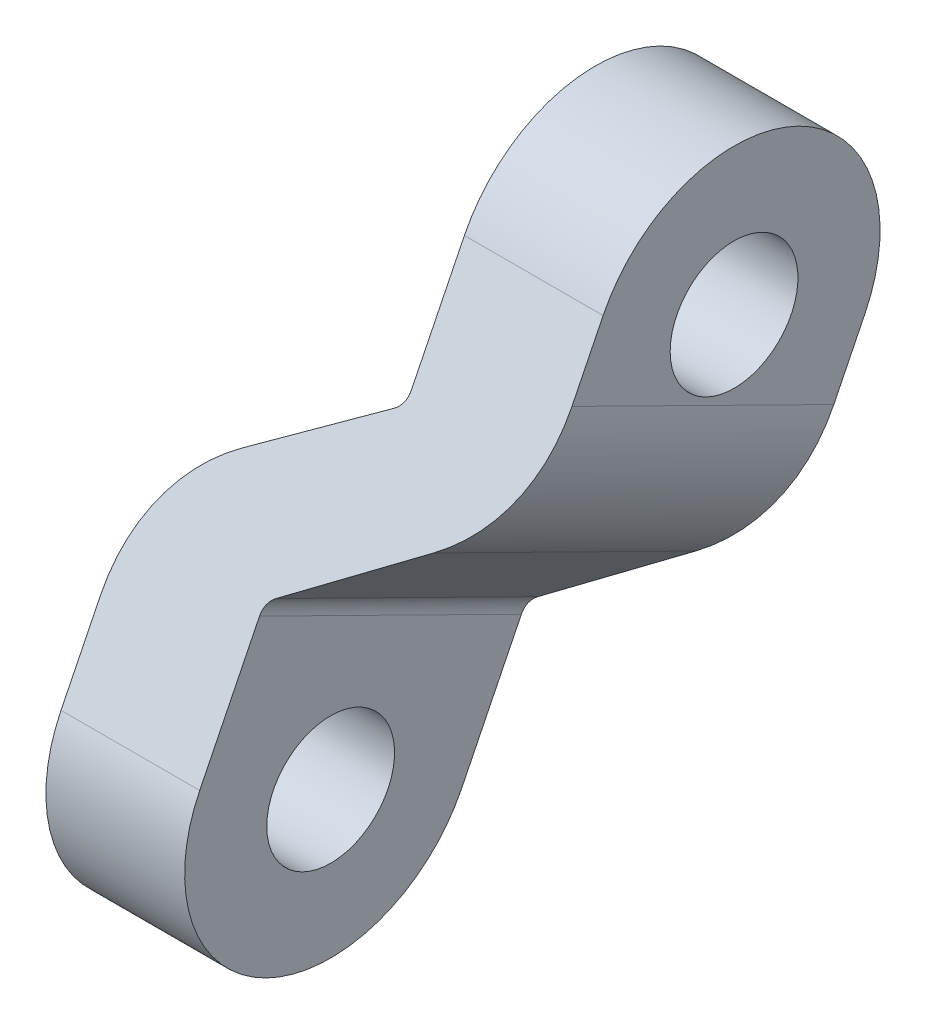
ISO-10303-21;
HEADER;
FILE_DESCRIPTION(('STEP AP214'),'2;1');
FILE_NAME('part.step','',(''),(''),'','','');
FILE_SCHEMA(('AUTOMOTIVE_DESIGN { 1 0 10303 214 1 1 1 1 }'));
ENDSEC;
DATA;
#1=APPLICATION_CONTEXT('core data for automotive mechanical design processes');
#2=APPLICATION_PROTOCOL_DEFINITION('international standard','automotive_design',2000,#1);
#3=PRODUCT_CONTEXT('',#1,'mechanical');
#4=PRODUCT('Part','Part','',(#3));
#5=PRODUCT_RELATED_PRODUCT_CATEGORY('part','',(#4));
#6=PRODUCT_DEFINITION_FORMATION('','',#4);
#7=PRODUCT_DEFINITION_CONTEXT('part definition',#1,'design');
#8=PRODUCT_DEFINITION('design','',#6,#7);
#9=PRODUCT_DEFINITION_SHAPE('','',#8);
#10=(LENGTH_UNIT() NAMED_UNIT(*) SI_UNIT(.MILLI.,.METRE.));
#11=(NAMED_UNIT(*) PLANE_ANGLE_UNIT() SI_UNIT($,.RADIAN.));
#12=(NAMED_UNIT(*) SI_UNIT($,.STERADIAN.) SOLID_ANGLE_UNIT());
#13=UNCERTAINTY_MEASURE_WITH_UNIT(LENGTH_MEASURE(1.E-05),#10,'distance_accuracy_value','');
#14=(GEOMETRIC_REPRESENTATION_CONTEXT(3) GLOBAL_UNCERTAINTY_ASSIGNED_CONTEXT((#13)) GLOBAL_UNIT_ASSIGNED_CONTEXT((#10,
#11,#12)) REPRESENTATION_CONTEXT('',''));
#15=CARTESIAN_POINT('',(0.,0.,0.));
#16=DIRECTION('',(0.,0.,1.));
#17=DIRECTION('',(1.,0.,0.));
#18=AXIS2_PLACEMENT_3D('',#15,#16,#17);
#19=CARTESIAN_POINT('',(-31.2808383876836,-34.2216398458266,-78.2312229652691));
#20=DIRECTION('',(1.,0.,0.));
#21=DIRECTION('',(0.,0.,-1.));
#22=AXIS2_PLACEMENT_3D('',#19,#20,#21);
#23=PLANE('',#22);
#24=DIRECTION('',(0.,-0.89666578156707,0.44270811621961));
#25=VECTOR('',#24,1.);
#26=CARTESIAN_POINT('',(-31.2808383876836,-40.567413857167,-91.0840219202898));
#27=LINE('',#26,#25);
#28=CARTESIAN_POINT('',(-31.2808383876836,-44.5116153096804,-89.1366631262682));
#29=VERTEX_POINT('',#28);
#30=CARTESIAN_POINT('',(-31.2808383876836,-47.4618516108228,-87.680051775494));
#31=VERTEX_POINT('',#30);
#32=EDGE_CURVE('E145',#29,#31,#27,.T.);
#33=ORIENTED_EDGE('',*,*,#32,.T.);
#34=DIRECTION('',(0.,-0.442708116219611,-0.89666578156707));
#35=VECTOR('',#34,1.);
#36=CARTESIAN_POINT('',(-31.2808383876836,-43.9201866810659,-80.5067255229574));
#37=LINE('',#36,#35);
#38=CARTESIAN_POINT('',(-31.2808383876836,-43.9201866810659,-80.5067255229574));
#39=VERTEX_POINT('',#38);
#40=EDGE_CURVE('E193',#31,#39,#37,.F.);
#41=ORIENTED_EDGE('',*,*,#40,.T.);
#42=DIRECTION('',(0.,0.896665781567074,-0.442708116219602));
#43=VECTOR('',#42,1.);
#44=CARTESIAN_POINT('',(-31.2808383876836,-40.9699503799235,-81.9633368737316));
#45=LINE('',#44,#43);
#46=CARTESIAN_POINT('',(-31.2808383876836,-40.9699503799235,-81.9633368737316));
#47=VERTEX_POINT('',#46);
#48=EDGE_CURVE('E169',#39,#47,#45,.T.);
#49=ORIENTED_EDGE('',*,*,#48,.T.);
#50=CARTESIAN_POINT('',(-31.2808383876836,-42.7407828448019,-85.55));
#51=DIRECTION('',(1.,0.,0.));
#52=DIRECTION('',(0.,0.,-1.));
#53=AXIS2_PLACEMENT_3D('',#50,#51,#52);
#54=CIRCLE('',#53,4.00000000000002);
#55=EDGE_CURVE('E244',#47,#29,#54,.F.);
#56=ORIENTED_EDGE('',*,*,#55,.T.);
#57=EDGE_LOOP('',(#33,#41,#49,#56));
#58=FACE_BOUND('',#57,.T.);
#59=CARTESIAN_POINT('',(-31.2808383876836,-42.7407828448019,-85.55));
#60=DIRECTION('',(-1.,0.,0.));
#61=DIRECTION('',(0.,0.,1.));
#62=AXIS2_PLACEMENT_3D('',#59,#60,#61);
#63=CIRCLE('',#62,1.75000000000002);
#64=CARTESIAN_POINT('',(-31.2808383876836,-42.7407828448019,-83.8));
#65=VERTEX_POINT('',#64);
#66=EDGE_CURVE('E280',#65,#65,#63,.T.);
#67=ORIENTED_EDGE('',*,*,#66,.F.);
#68=EDGE_LOOP('',(#67));
#69=FACE_BOUND('',#68,.T.);
#70=ADVANCED_FACE('F43',(#58,#69),#23,.F.);
#71=CARTESIAN_POINT('',(-36.7808383876836,-42.7407828448019,-85.55));
#72=DIRECTION('',(1.,0.,0.));
#73=DIRECTION('',(0.,0.,-1.));
#74=AXIS2_PLACEMENT_3D('',#71,#72,#73);
#75=PLANE('',#74);
#76=DIRECTION('',(0.,-0.896665781567074,0.442708116219602));
#77=VECTOR('',#76,1.);
#78=CARTESIAN_POINT('',(-36.7808383876836,-40.9699503799235,-81.9633368737316));
#79=LINE('',#78,#77);
#80=CARTESIAN_POINT('',(-36.7808383876836,-50.0248169702635,-77.4927046568721));
#81=VERTEX_POINT('',#80);
#82=CARTESIAN_POINT('',(-36.7808383876836,-52.2109800908596,-76.4133368737318));
#83=VERTEX_POINT('',#82);
#84=EDGE_CURVE('E231',#81,#83,#79,.T.);
#85=ORIENTED_EDGE('',*,*,#84,.F.);
#86=DIRECTION('',(0.,-0.442708116219611,-0.89666578156707));
#87=VECTOR('',#86,1.);
#88=CARTESIAN_POINT('',(-36.7808383876836,-51.7956494351419,-81.0793677831404));
#89=LINE('',#88,#87);
#90=CARTESIAN_POINT('',(-36.7808383876836,-53.5664819000203,-84.6660309094086));
#91=VERTEX_POINT('',#90);
#92=EDGE_CURVE('E52',#81,#91,#89,.T.);
#93=ORIENTED_EDGE('',*,*,#92,.T.);
#94=DIRECTION('',(0.,0.89666578156707,-0.442708116219611));
#95=VECTOR('',#94,1.);
#96=CARTESIAN_POINT('',(-36.7808383876836,-55.7526450206165,-83.5866631262682));
#97=LINE('',#96,#95);
#98=CARTESIAN_POINT('',(-36.7808383876836,-55.7526450206165,-83.5866631262682));
#99=VERTEX_POINT('',#98);
#100=EDGE_CURVE('E177',#99,#91,#97,.T.);
#101=ORIENTED_EDGE('',*,*,#100,.F.);
#102=CARTESIAN_POINT('',(-36.7808383876836,-53.981812555738,-80.));
#103=DIRECTION('',(1.,0.,0.));
#104=DIRECTION('',(0.,0.,-1.));
#105=AXIS2_PLACEMENT_3D('',#102,#103,#104);
#106=CIRCLE('',#105,3.99999999999996);
#107=EDGE_CURVE('E160',#83,#99,#106,.T.);
#108=ORIENTED_EDGE('',*,*,#107,.F.);
#109=EDGE_LOOP('',(#85,#93,#101,#108));
#110=FACE_BOUND('',#109,.T.);
#111=CARTESIAN_POINT('',(-36.7808383876836,-53.981812555738,-80.));
#112=DIRECTION('',(-1.,0.,0.));
#113=DIRECTION('',(0.,0.,1.));
#114=AXIS2_PLACEMENT_3D('',#111,#112,#113);
#115=CIRCLE('',#114,1.75000000000002);
#116=CARTESIAN_POINT('',(-36.7808383876836,-53.981812555738,-78.25));
#117=VERTEX_POINT('',#116);
#118=EDGE_CURVE('E272',#117,#117,#115,.T.);
#119=ORIENTED_EDGE('',*,*,#118,.F.);
#120=EDGE_LOOP('',(#119));
#121=FACE_BOUND('',#120,.T.);
#122=ADVANCED_FACE('F229',(#110,#121),#75,.F.);
#123=CARTESIAN_POINT('',(-36.7808383876836,-42.7407828448019,-85.55));
#124=DIRECTION('',(1.,0.,0.));
#125=DIRECTION('',(0.,0.,-1.));
#126=AXIS2_PLACEMENT_3D('',#123,#124,#125);
#127=CYLINDRICAL_SURFACE('',#126,4.00000000000002);
#128=ORIENTED_EDGE('',*,*,#55,.F.);
#129=DIRECTION('',(1.,0.,0.));
#130=VECTOR('',#129,1.);
#131=CARTESIAN_POINT('',(-36.7808383876836,-40.9699503799235,-81.9633368737316));
#132=LINE('',#131,#130);
#133=CARTESIAN_POINT('',(-27.4808383876836,-40.9699503799235,-81.9633368737316));
#134=VERTEX_POINT('',#133);
#135=EDGE_CURVE('E171',#47,#134,#132,.T.);
#136=ORIENTED_EDGE('',*,*,#135,.T.);
#137=CARTESIAN_POINT('',(-27.4808383876836,-42.7407828448019,-85.55));
#138=DIRECTION('',(1.,0.,0.));
#139=DIRECTION('',(0.,0.,-1.));
#140=AXIS2_PLACEMENT_3D('',#137,#138,#139);
#141=CIRCLE('',#140,4.00000000000002);
#142=CARTESIAN_POINT('',(-27.4808383876836,-44.5116153096804,-89.1366631262682));
#143=VERTEX_POINT('',#142);
#144=EDGE_CURVE('E239',#143,#134,#141,.T.);
#145=ORIENTED_EDGE('',*,*,#144,.F.);
#146=DIRECTION('',(1.,0.,0.));
#147=VECTOR('',#146,1.);
#148=CARTESIAN_POINT('',(-36.7808383876836,-44.5116153096804,-89.1366631262682));
#149=LINE('',#148,#147);
#150=EDGE_CURVE('E163',#29,#143,#149,.T.);
#151=ORIENTED_EDGE('',*,*,#150,.F.);
#152=EDGE_LOOP('',(#128,#136,#145,#151));
#153=FACE_BOUND('',#152,.T.);
#154=ADVANCED_FACE('F293',(#153),#127,.T.);
#155=CARTESIAN_POINT('',(-36.7808383876836,-55.7526450206165,-83.5866631262682));
#156=DIRECTION('',(0.,-0.442708116219611,-0.89666578156707));
#157=DIRECTION('',(0.,0.89666578156707,-0.442708116219611));
#158=AXIS2_PLACEMENT_3D('',#155,#156,#157);
#159=PLANE('',#158);
#160=DIRECTION('',(0.,0.89666578156707,-0.442708116219611));
#161=VECTOR('',#160,1.);
#162=CARTESIAN_POINT('',(-27.4808383876836,-55.7526450206165,-83.5866631262682));
#163=LINE('',#162,#161);
#164=CARTESIAN_POINT('',(-27.4808383876836,-46.2406565279128,-88.2829887736549));
#165=VERTEX_POINT('',#164);
#166=EDGE_CURVE('E247',#165,#143,#163,.T.);
#167=ORIENTED_EDGE('',*,*,#166,.F.);
#168=CARTESIAN_POINT('',(-32.4808383876836,-46.2406565279128,-88.2829887736549));
#169=DIRECTION('',(0.,-0.442708116219611,-0.89666578156707));
#170=DIRECTION('',(0.,0.89666578156707,-0.442708116219611));
#171=AXIS2_PLACEMENT_3D('',#168,#169,#170);
#172=CIRCLE('',#171,5.);
#173=CARTESIAN_POINT('',(-29.4932084571077,-49.8356117814134,-86.5080622615831));
#174=VERTEX_POINT('',#173);
#175=EDGE_CURVE('E224',#165,#174,#172,.T.);
#176=ORIENTED_EDGE('',*,*,#175,.T.);
#177=DIRECTION('',(0.80184954693326,0.535781105346607,-0.26452960370532));
#178=VECTOR('',#177,1.);
#179=CARTESIAN_POINT('',(-32.9808383876836,-52.1659818943486,-85.3574955911466));
#180=LINE('',#179,#178);
#181=CARTESIAN_POINT('',(-32.7393539793527,-52.0046264583889,-85.4371611282552));
#182=VERTEX_POINT('',#181);
#183=EDGE_CURVE('E155',#182,#174,#180,.T.);
#184=ORIENTED_EDGE('',*,*,#183,.F.);
#185=CARTESIAN_POINT('',(-32.3808383876836,-52.4360210888089,-85.2241699468066));
#186=DIRECTION('',(0.,-0.442708116219611,-0.89666578156707));
#187=DIRECTION('',(0.,0.89666578156707,-0.442708116219611));
#188=AXIS2_PLACEMENT_3D('',#185,#186,#187);
#189=CIRCLE('',#188,0.6);
#190=CARTESIAN_POINT('',(-32.9808383876836,-52.4360210888089,-85.2241699468066));
#191=VERTEX_POINT('',#190);
#192=EDGE_CURVE('E153',#182,#191,#189,.F.);
#193=ORIENTED_EDGE('',*,*,#192,.T.);
#194=DIRECTION('',(0.,0.89666578156707,-0.44270811621961));
#195=VECTOR('',#194,1.);
#196=CARTESIAN_POINT('',(-32.9808383876836,-60.1476383087879,-81.4167362266338));
#197=LINE('',#196,#195);
#198=CARTESIAN_POINT('',(-32.9808383876836,-55.7526450206165,-83.5866631262683));
#199=VERTEX_POINT('',#198);
#200=EDGE_CURVE('E136',#199,#191,#197,.T.);
#201=ORIENTED_EDGE('',*,*,#200,.F.);
#202=DIRECTION('',(1.,0.,0.));
#203=VECTOR('',#202,1.);
#204=CARTESIAN_POINT('',(-36.7808383876836,-55.7526450206165,-83.5866631262682));
#205=LINE('',#204,#203);
#206=EDGE_CURVE('E150',#99,#199,#205,.T.);
#207=ORIENTED_EDGE('',*,*,#206,.F.);
#208=ORIENTED_EDGE('',*,*,#100,.T.);
#209=CARTESIAN_POINT('',(-31.7808383876836,-53.5664819000203,-84.6660309094086));
#210=DIRECTION('',(0.,-0.442708116219611,-0.89666578156707));
#211=DIRECTION('',(0.,0.89666578156707,-0.442708116219611));
#212=AXIS2_PLACEMENT_3D('',#209,#210,#211);
#213=CIRCLE('',#212,5.);
#214=CARTESIAN_POINT('',(-34.685074672088,-49.9169958134439,-86.4678807667037));
#215=VERTEX_POINT('',#214);
#216=EDGE_CURVE('E59',#91,#215,#213,.T.);
#217=ORIENTED_EDGE('',*,*,#216,.T.);
#218=DIRECTION('',(-0.814012570034367,-0.520825859562183,0.257145794905064));
#219=VECTOR('',#218,1.);
#220=CARTESIAN_POINT('',(-31.2808383876836,-47.7388792164203,-87.5432757638115));
#221=LINE('',#220,#219);
#222=CARTESIAN_POINT('',(-31.5323300335551,-47.899789941212,-87.4638297926186));
#223=VERTEX_POINT('',#222);
#224=EDGE_CURVE('E258',#223,#215,#221,.T.);
#225=ORIENTED_EDGE('',*,*,#224,.F.);
#226=CARTESIAN_POINT('',(-31.8808383876836,-47.4618516108228,-87.680051775494));
#227=DIRECTION('',(0.,-0.442708116219611,-0.89666578156707));
#228=DIRECTION('',(0.,0.89666578156707,-0.442708116219611));
#229=AXIS2_PLACEMENT_3D('',#226,#227,#228);
#230=CIRCLE('',#229,0.6);
#231=EDGE_CURVE('E202',#223,#31,#230,.F.);
#232=ORIENTED_EDGE('',*,*,#231,.T.);
#233=ORIENTED_EDGE('',*,*,#32,.F.);
#234=ORIENTED_EDGE('',*,*,#150,.T.);
#235=EDGE_LOOP('',(#167,#176,#184,#193,#201,#207,#208,#217,#225,#232,#233,#234));
#236=FACE_BOUND('',#235,.T.);
#237=ADVANCED_FACE('F149',(#236),#159,.T.);
#238=CARTESIAN_POINT('',(-36.7808383876836,-53.981812555738,-80.));
#239=DIRECTION('',(1.,0.,0.));
#240=DIRECTION('',(0.,0.,-1.));
#241=AXIS2_PLACEMENT_3D('',#238,#239,#240);
#242=CYLINDRICAL_SURFACE('',#241,3.99999999999996);
#243=CARTESIAN_POINT('',(-32.9808383876836,-53.981812555738,-80.));
#244=DIRECTION('',(-1.,0.,0.));
#245=DIRECTION('',(0.,0.,1.));
#246=AXIS2_PLACEMENT_3D('',#243,#244,#245);
#247=CIRCLE('',#246,3.99999999999996);
#248=CARTESIAN_POINT('',(-32.9808383876836,-52.2109800908596,-76.4133368737318));
#249=VERTEX_POINT('',#248);
#250=EDGE_CURVE('E133',#249,#199,#247,.F.);
#251=ORIENTED_EDGE('',*,*,#250,.F.);
#252=DIRECTION('',(1.,0.,0.));
#253=VECTOR('',#252,1.);
#254=CARTESIAN_POINT('',(-36.7808383876836,-52.2109800908596,-76.4133368737318));
#255=LINE('',#254,#253);
#256=EDGE_CURVE('E164',#83,#249,#255,.T.);
#257=ORIENTED_EDGE('',*,*,#256,.F.);
#258=ORIENTED_EDGE('',*,*,#107,.T.);
#259=ORIENTED_EDGE('',*,*,#206,.T.);
#260=EDGE_LOOP('',(#251,#257,#258,#259));
#261=FACE_BOUND('',#260,.T.);
#262=ADVANCED_FACE('F158',(#261),#242,.T.);
#263=CARTESIAN_POINT('',(-36.7808383876836,-40.9699503799235,-81.9633368737316));
#264=DIRECTION('',(0.,0.442708116219602,0.896665781567074));
#265=DIRECTION('',(0.,-0.896665781567074,0.442708116219602));
#266=AXIS2_PLACEMENT_3D('',#263,#264,#265);
#267=PLANE('',#266);
#268=DIRECTION('',(-0.80184954693326,-0.535781105346609,0.264529603705314));
#269=VECTOR('',#268,1.);
#270=CARTESIAN_POINT('',(-31.3340491809078,-47.5239627337341,-78.7274439440777));
#271=LINE('',#270,#269);
#272=CARTESIAN_POINT('',(-29.4932084571077,-46.2939468516565,-79.3347360090465));
#273=VERTEX_POINT('',#272);
#274=CARTESIAN_POINT('',(-32.7393539793527,-48.462961528632,-78.2638348757187));
#275=VERTEX_POINT('',#274);
#276=EDGE_CURVE('E146',#273,#275,#271,.T.);
#277=ORIENTED_EDGE('',*,*,#276,.F.);
#278=CARTESIAN_POINT('',(-32.4808383876836,-42.6989915981559,-81.1096625211184));
#279=DIRECTION('',(0.,0.442708116219602,0.896665781567074));
#280=DIRECTION('',(0.,-0.896665781567074,0.442708116219602));
#281=AXIS2_PLACEMENT_3D('',#278,#279,#280);
#282=CIRCLE('',#281,5.);
#283=CARTESIAN_POINT('',(-27.4808383876836,-42.6989915981559,-81.1096625211184));
#284=VERTEX_POINT('',#283);
#285=EDGE_CURVE('E216',#273,#284,#282,.T.);
#286=ORIENTED_EDGE('',*,*,#285,.T.);
#287=DIRECTION('',(0.,-0.896665781567074,0.442708116219602));
#288=VECTOR('',#287,1.);
#289=CARTESIAN_POINT('',(-27.4808383876836,-40.9699503799235,-81.9633368737316));
#290=LINE('',#289,#288);
#291=EDGE_CURVE('E243',#134,#284,#290,.T.);
#292=ORIENTED_EDGE('',*,*,#291,.F.);
#293=ORIENTED_EDGE('',*,*,#135,.F.);
#294=ORIENTED_EDGE('',*,*,#48,.F.);
#295=CARTESIAN_POINT('',(-31.8808383876836,-43.9201866810659,-80.5067255229574));
#296=DIRECTION('',(0.,0.442708116219602,0.896665781567074));
#297=DIRECTION('',(0.,-0.896665781567074,0.442708116219602));
#298=AXIS2_PLACEMENT_3D('',#295,#296,#297);
#299=CIRCLE('',#298,0.6);
#300=CARTESIAN_POINT('',(-31.5323300335551,-44.358125011455,-80.290503540082));
#301=VERTEX_POINT('',#300);
#302=EDGE_CURVE('E205',#39,#301,#299,.F.);
#303=ORIENTED_EDGE('',*,*,#302,.T.);
#304=DIRECTION('',(0.814012570034367,0.520825859562186,-0.257145794905058));
#305=VECTOR('',#304,1.);
#306=CARTESIAN_POINT('',(-33.2234743204839,-45.4401619594179,-79.756272671948));
#307=LINE('',#306,#305);
#308=CARTESIAN_POINT('',(-34.685074672088,-46.375330883687,-79.2945545141671));
#309=VERTEX_POINT('',#308);
#310=EDGE_CURVE('E255',#309,#301,#307,.T.);
#311=ORIENTED_EDGE('',*,*,#310,.F.);
#312=CARTESIAN_POINT('',(-31.7808383876836,-50.0248169702635,-77.4927046568721));
#313=DIRECTION('',(0.,0.442708116219602,0.896665781567074));
#314=DIRECTION('',(0.,-0.896665781567074,0.442708116219602));
#315=AXIS2_PLACEMENT_3D('',#312,#313,#314);
#316=CIRCLE('',#315,5.);
#317=EDGE_CURVE('E213',#309,#81,#316,.T.);
#318=ORIENTED_EDGE('',*,*,#317,.T.);
#319=ORIENTED_EDGE('',*,*,#84,.T.);
#320=ORIENTED_EDGE('',*,*,#256,.T.);
#321=DIRECTION('',(0.,-0.896665781567074,0.442708116219602));
#322=VECTOR('',#321,1.);
#323=CARTESIAN_POINT('',(-32.9808383876836,-40.9699503799235,-81.9633368737316));
#324=LINE('',#323,#322);
#325=CARTESIAN_POINT('',(-32.9808383876836,-48.8943561590521,-78.0508436942701));
#326=VERTEX_POINT('',#325);
#327=EDGE_CURVE('E139',#326,#249,#324,.T.);
#328=ORIENTED_EDGE('',*,*,#327,.F.);
#329=CARTESIAN_POINT('',(-32.3808383876836,-48.8943561590521,-78.0508436942701));
#330=DIRECTION('',(0.,0.442708116219602,0.896665781567074));
#331=DIRECTION('',(0.,-0.896665781567074,0.442708116219602));
#332=AXIS2_PLACEMENT_3D('',#329,#330,#331);
#333=CIRCLE('',#332,0.6);
#334=EDGE_CURVE('E198',#326,#275,#333,.F.);
#335=ORIENTED_EDGE('',*,*,#334,.T.);
#336=EDGE_LOOP('',(#277,#286,#292,#293,#294,#303,#311,#318,#319,#320,#328,#335));
#337=FACE_BOUND('',#336,.T.);
#338=ADVANCED_FACE('F302',(#337),#267,.T.);
#339=CARTESIAN_POINT('',(-27.4808383876836,-42.7407828448019,-85.55));
#340=DIRECTION('',(1.,0.,0.));
#341=DIRECTION('',(0.,0.,-1.));
#342=AXIS2_PLACEMENT_3D('',#339,#340,#341);
#343=PLANE('',#342);
#344=CARTESIAN_POINT('',(-27.4808383876836,-42.7407828448019,-85.55));
#345=DIRECTION('',(-1.,0.,0.));
#346=DIRECTION('',(0.,0.,1.));
#347=AXIS2_PLACEMENT_3D('',#344,#345,#346);
#348=CIRCLE('',#347,1.75000000000002);
#349=CARTESIAN_POINT('',(-27.4808383876836,-42.7407828448019,-83.8));
#350=VERTEX_POINT('',#349);
#351=EDGE_CURVE('E276',#350,#350,#348,.T.);
#352=ORIENTED_EDGE('',*,*,#351,.T.);
#353=EDGE_LOOP('',(#352));
#354=FACE_BOUND('',#353,.T.);
#355=ORIENTED_EDGE('',*,*,#291,.T.);
#356=DIRECTION('',(0.,0.442708116219611,0.89666578156707));
#357=VECTOR('',#356,1.);
#358=CARTESIAN_POINT('',(-27.4808383876836,-46.2406565279128,-88.2829887736549));
#359=LINE('',#358,#357);
#360=EDGE_CURVE('E219',#284,#165,#359,.F.);
#361=ORIENTED_EDGE('',*,*,#360,.T.);
#362=ORIENTED_EDGE('',*,*,#166,.T.);
#363=ORIENTED_EDGE('',*,*,#144,.T.);
#364=EDGE_LOOP('',(#355,#361,#362,#363));
#365=FACE_BOUND('',#364,.T.);
#366=ADVANCED_FACE('F299',(#354,#365),#343,.T.);
#367=CARTESIAN_POINT('',(-31.2808383876836,-41.3931052050799,-74.6904768087908));
#368=DIRECTION('',(0.580847256880881,-0.729897217315285,0.360369971458999));
#369=DIRECTION('',(0.782471930988145,0.622685857568391,0.));
#370=AXIS2_PLACEMENT_3D('',#367,#368,#369);
#371=PLANE('',#370);
#372=ORIENTED_EDGE('',*,*,#224,.T.);
#373=DIRECTION('',(0.,-0.442708116219611,-0.89666578156707));
#374=VECTOR('',#373,1.);
#375=CARTESIAN_POINT('',(-34.685074672088,-43.5712218021035,-73.615081811683));
#376=LINE('',#375,#374);
#377=EDGE_CURVE('E11',#215,#309,#376,.F.);
#378=ORIENTED_EDGE('',*,*,#377,.T.);
#379=ORIENTED_EDGE('',*,*,#310,.T.);
#380=DIRECTION('',(0.,-0.442708116219611,-0.89666578156707));
#381=VECTOR('',#380,1.);
#382=CARTESIAN_POINT('',(-31.5323300335551,-47.899789941212,-87.4638297926186));
#383=LINE('',#382,#381);
#384=EDGE_CURVE('E189',#301,#223,#383,.T.);
#385=ORIENTED_EDGE('',*,*,#384,.T.);
#386=EDGE_LOOP('',(#372,#378,#379,#385));
#387=FACE_BOUND('',#386,.T.);
#388=ADVANCED_FACE('F296',(#387),#371,.F.);
#389=CARTESIAN_POINT('',(-32.9808383876836,-45.8202078830081,-72.5046966361259));
#390=DIRECTION('',(-0.597525986115186,0.718991050700113,-0.354985302414372));
#391=DIRECTION('',(-0.769079768923508,-0.639152805698734,0.));
#392=AXIS2_PLACEMENT_3D('',#389,#390,#391);
#393=PLANE('',#392);
#394=ORIENTED_EDGE('',*,*,#183,.T.);
#395=DIRECTION('',(0.,0.442708116219611,0.89666578156707));
#396=VECTOR('',#395,1.);
#397=CARTESIAN_POINT('',(-29.4932084571077,-46.2939468516565,-79.3347360090465));
#398=LINE('',#397,#396);
#399=EDGE_CURVE('E209',#174,#273,#398,.T.);
#400=ORIENTED_EDGE('',*,*,#399,.T.);
#401=ORIENTED_EDGE('',*,*,#276,.T.);
#402=DIRECTION('',(0.,-0.442708116219611,-0.89666578156707));
#403=VECTOR('',#402,1.);
#404=CARTESIAN_POINT('',(-32.7393539793527,-52.0046264583889,-85.4371611282552));
#405=LINE('',#404,#403);
#406=EDGE_CURVE('E182',#275,#182,#405,.T.);
#407=ORIENTED_EDGE('',*,*,#406,.T.);
#408=EDGE_LOOP('',(#394,#400,#401,#407));
#409=FACE_BOUND('',#408,.T.);
#410=ADVANCED_FACE('F330',(#409),#393,.F.);
#411=CARTESIAN_POINT('',(-32.9808383876836,-53.8018642974474,-68.5639372716131));
#412=DIRECTION('',(-1.,0.,0.));
#413=DIRECTION('',(0.,0.,1.));
#414=AXIS2_PLACEMENT_3D('',#411,#412,#413);
#415=PLANE('',#414);
#416=CARTESIAN_POINT('',(-32.9808383876836,-53.981812555738,-80.));
#417=DIRECTION('',(-1.,0.,0.));
#418=DIRECTION('',(0.,0.,1.));
#419=AXIS2_PLACEMENT_3D('',#416,#417,#418);
#420=CIRCLE('',#419,1.75000000000002);
#421=CARTESIAN_POINT('',(-32.9808383876836,-53.981812555738,-78.25));
#422=VERTEX_POINT('',#421);
#423=EDGE_CURVE('E156',#422,#422,#420,.T.);
#424=ORIENTED_EDGE('',*,*,#423,.T.);
#425=EDGE_LOOP('',(#424));
#426=FACE_BOUND('',#425,.T.);
#427=ORIENTED_EDGE('',*,*,#200,.T.);
#428=DIRECTION('',(0.,-0.442708116219611,-0.89666578156707));
#429=VECTOR('',#428,1.);
#430=CARTESIAN_POINT('',(-32.9808383876836,-48.8943561590521,-78.05084369427));
#431=LINE('',#430,#429);
#432=EDGE_CURVE('E186',#191,#326,#431,.F.);
#433=ORIENTED_EDGE('',*,*,#432,.T.);
#434=ORIENTED_EDGE('',*,*,#327,.T.);
#435=ORIENTED_EDGE('',*,*,#250,.T.);
#436=EDGE_LOOP('',(#427,#433,#434,#435));
#437=FACE_BOUND('',#436,.T.);
#438=ADVANCED_FACE('F135',(#426,#437),#415,.F.);
#439=CARTESIAN_POINT('',(-36.7808383876836,-53.981812555738,-80.));
#440=DIRECTION('',(-1.,0.,0.));
#441=DIRECTION('',(0.,0.,1.));
#442=AXIS2_PLACEMENT_3D('',#439,#440,#441);
#443=CYLINDRICAL_SURFACE('',#442,1.75000000000002);
#444=ORIENTED_EDGE('',*,*,#423,.F.);
#445=EDGE_LOOP('',(#444));
#446=FACE_BOUND('',#445,.T.);
#447=ORIENTED_EDGE('',*,*,#118,.T.);
#448=EDGE_LOOP('',(#447));
#449=FACE_BOUND('',#448,.T.);
#450=ADVANCED_FACE('F354',(#446,#449),#443,.F.);
#451=CARTESIAN_POINT('',(-31.2808383876836,-42.7407828448019,-85.55));
#452=DIRECTION('',(-1.,0.,0.));
#453=DIRECTION('',(0.,0.,1.));
#454=AXIS2_PLACEMENT_3D('',#451,#452,#453);
#455=CYLINDRICAL_SURFACE('',#454,1.75000000000002);
#456=ORIENTED_EDGE('',*,*,#351,.F.);
#457=EDGE_LOOP('',(#456));
#458=FACE_BOUND('',#457,.T.);
#459=ORIENTED_EDGE('',*,*,#66,.T.);
#460=EDGE_LOOP('',(#459));
#461=FACE_BOUND('',#460,.T.);
#462=ADVANCED_FACE('F285',(#458,#461),#455,.F.);
#463=CARTESIAN_POINT('',(-32.3808383876836,-46.0902470774685,-72.3713709917859));
#464=DIRECTION('',(0.,0.442708116219611,0.896665781567069));
#465=DIRECTION('',(0.,-0.89666578156707,0.442708116219611));
#466=AXIS2_PLACEMENT_3D('',#463,#464,#465);
#467=CYLINDRICAL_SURFACE('',#466,0.6);
#468=ORIENTED_EDGE('',*,*,#334,.F.);
#469=ORIENTED_EDGE('',*,*,#432,.F.);
#470=ORIENTED_EDGE('',*,*,#192,.F.);
#471=ORIENTED_EDGE('',*,*,#406,.F.);
#472=EDGE_LOOP('',(#468,#469,#470,#471));
#473=FACE_BOUND('',#472,.T.);
#474=ADVANCED_FACE('F313',(#473),#467,.F.);
#475=CARTESIAN_POINT('',(-31.8808383876836,-41.1160775994823,-74.8272528204733));
#476=DIRECTION('',(0.,0.442708116219611,0.89666578156707));
#477=DIRECTION('',(0.,-0.89666578156707,0.442708116219611));
#478=AXIS2_PLACEMENT_3D('',#475,#476,#477);
#479=CYLINDRICAL_SURFACE('',#478,0.6);
#480=ORIENTED_EDGE('',*,*,#302,.F.);
#481=ORIENTED_EDGE('',*,*,#40,.F.);
#482=ORIENTED_EDGE('',*,*,#231,.F.);
#483=ORIENTED_EDGE('',*,*,#384,.F.);
#484=EDGE_LOOP('',(#480,#481,#482,#483));
#485=FACE_BOUND('',#484,.T.);
#486=ADVANCED_FACE('F316',(#485),#479,.F.);
#487=CARTESIAN_POINT('',(-32.4808383876836,-39.8948825165724,-75.4301898186343));
#488=DIRECTION('',(0.,-0.442708116219611,-0.896665781567069));
#489=DIRECTION('',(0.,0.89666578156707,-0.442708116219611));
#490=AXIS2_PLACEMENT_3D('',#487,#488,#489);
#491=CYLINDRICAL_SURFACE('',#490,5.);
#492=ORIENTED_EDGE('',*,*,#175,.F.);
#493=ORIENTED_EDGE('',*,*,#360,.F.);
#494=ORIENTED_EDGE('',*,*,#285,.F.);
#495=ORIENTED_EDGE('',*,*,#399,.F.);
#496=EDGE_LOOP('',(#492,#493,#494,#495));
#497=FACE_BOUND('',#496,.T.);
#498=ADVANCED_FACE('F319',(#497),#491,.T.);
#499=CARTESIAN_POINT('',(-31.7808383876836,-51.7956494351419,-81.0793677831404));
#500=DIRECTION('',(0.,-0.442708116219611,-0.89666578156707));
#501=DIRECTION('',(0.,0.89666578156707,-0.442708116219611));
#502=AXIS2_PLACEMENT_3D('',#499,#500,#501);
#503=CYLINDRICAL_SURFACE('',#502,5.);
#504=ORIENTED_EDGE('',*,*,#317,.F.);
#505=ORIENTED_EDGE('',*,*,#377,.F.);
#506=ORIENTED_EDGE('',*,*,#216,.F.);
#507=ORIENTED_EDGE('',*,*,#92,.F.);
#508=EDGE_LOOP('',(#504,#505,#506,#507));
#509=FACE_BOUND('',#508,.T.);
#510=ADVANCED_FACE('F45',(#509),#503,.T.);
#511=CLOSED_SHELL('',(#70,#122,#154,#237,#262,#338,#366,#388,#410,#438,#450,#462,#474,#486,#498,#510));
#512=MANIFOLD_SOLID_BREP('B2',#511);
#513=ADVANCED_BREP_SHAPE_REPRESENTATION('',(#18,#512),#14);
#514=SHAPE_DEFINITION_REPRESENTATION(#9,#513);
ENDSEC;
END-ISO-10303-21;
